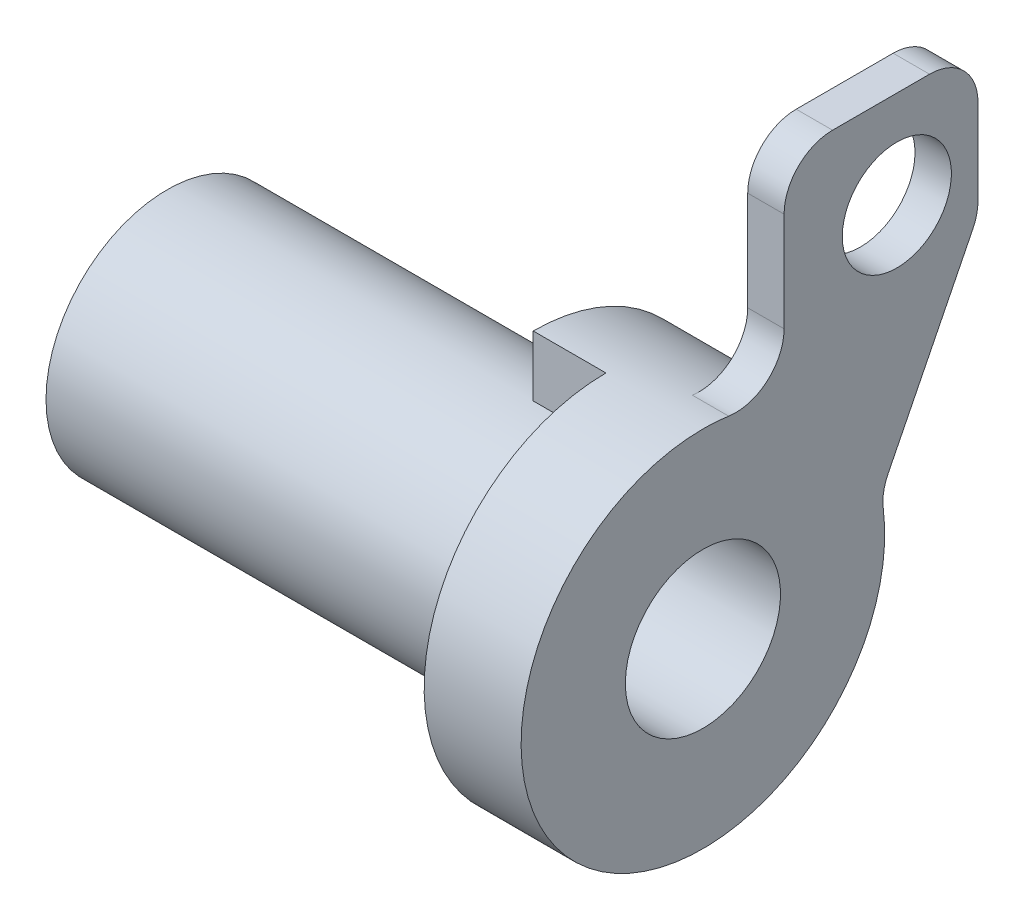
ISO-10303-21;
HEADER;
FILE_DESCRIPTION(('STEP AP214'),'2;1');
FILE_NAME('part.step','',(''),(''),'','','');
FILE_SCHEMA(('AUTOMOTIVE_DESIGN { 1 0 10303 214 1 1 1 1 }'));
ENDSEC;
DATA;
#1=APPLICATION_CONTEXT('core data for automotive mechanical design processes');
#2=APPLICATION_PROTOCOL_DEFINITION('international standard','automotive_design',2000,#1);
#3=PRODUCT_CONTEXT('',#1,'mechanical');
#4=PRODUCT('Part','Part','',(#3));
#5=PRODUCT_RELATED_PRODUCT_CATEGORY('part','',(#4));
#6=PRODUCT_DEFINITION_FORMATION('','',#4);
#7=PRODUCT_DEFINITION_CONTEXT('part definition',#1,'design');
#8=PRODUCT_DEFINITION('design','',#6,#7);
#9=PRODUCT_DEFINITION_SHAPE('','',#8);
#10=(LENGTH_UNIT() NAMED_UNIT(*) SI_UNIT(.MILLI.,.METRE.));
#11=(NAMED_UNIT(*) PLANE_ANGLE_UNIT() SI_UNIT($,.RADIAN.));
#12=(NAMED_UNIT(*) SI_UNIT($,.STERADIAN.) SOLID_ANGLE_UNIT());
#13=UNCERTAINTY_MEASURE_WITH_UNIT(LENGTH_MEASURE(1.E-05),#10,'distance_accuracy_value','');
#14=(GEOMETRIC_REPRESENTATION_CONTEXT(3) GLOBAL_UNCERTAINTY_ASSIGNED_CONTEXT((#13)) GLOBAL_UNIT_ASSIGNED_CONTEXT((#10,
#11,#12)) REPRESENTATION_CONTEXT('',''));
#15=CARTESIAN_POINT('',(0.,0.,0.));
#16=DIRECTION('',(0.,0.,1.));
#17=DIRECTION('',(1.,0.,0.));
#18=AXIS2_PLACEMENT_3D('',#15,#16,#17);
#19=CARTESIAN_POINT('',(0.,7.5,0.));
#20=DIRECTION('',(1.,0.,0.));
#21=DIRECTION('',(0.,0.,-1.));
#22=AXIS2_PLACEMENT_3D('',#19,#20,#21);
#23=PLANE('',#22);
#24=CARTESIAN_POINT('',(0.,0.,0.));
#25=DIRECTION('',(-1.,0.,0.));
#26=DIRECTION('',(0.,0.,1.));
#27=AXIS2_PLACEMENT_3D('',#24,#25,#26);
#28=CIRCLE('',#27,3.2);
#29=CARTESIAN_POINT('',(0.,0.,3.2));
#30=VERTEX_POINT('',#29);
#31=EDGE_CURVE('E222',#30,#30,#28,.T.);
#32=ORIENTED_EDGE('',*,*,#31,.F.);
#33=EDGE_LOOP('',(#32));
#34=FACE_BOUND('',#33,.T.);
#35=CARTESIAN_POINT('',(0.,0.,0.));
#36=DIRECTION('',(-1.,0.,0.));
#37=DIRECTION('',(0.,0.,1.));
#38=AXIS2_PLACEMENT_3D('',#35,#36,#37);
#39=CIRCLE('',#38,5.);
#40=CARTESIAN_POINT('',(0.,0.,5.));
#41=VERTEX_POINT('',#40);
#42=EDGE_CURVE('E199',#41,#41,#39,.T.);
#43=ORIENTED_EDGE('',*,*,#42,.T.);
#44=EDGE_LOOP('',(#43));
#45=FACE_BOUND('',#44,.T.);
#46=ADVANCED_FACE('F47',(#34,#45),#23,.F.);
#47=CARTESIAN_POINT('',(0.,0.,0.));
#48=DIRECTION('',(-1.,0.,0.));
#49=DIRECTION('',(0.,0.,1.));
#50=AXIS2_PLACEMENT_3D('',#47,#48,#49);
#51=CYLINDRICAL_SURFACE('',#50,7.5);
#52=CARTESIAN_POINT('',(20.6,0.,0.));
#53=DIRECTION('',(-1.,0.,0.));
#54=DIRECTION('',(0.,0.,-1.));
#55=AXIS2_PLACEMENT_3D('',#52,#53,#54);
#56=CIRCLE('',#55,7.5);
#57=CARTESIAN_POINT('',(20.6,7.42406003200721,-1.06458096974963));
#58=VERTEX_POINT('',#57);
#59=CARTESIAN_POINT('',(20.6,0.933969702377935,-7.4416194873858));
#60=VERTEX_POINT('',#59);
#61=EDGE_CURVE('E305',#58,#60,#56,.T.);
#62=ORIENTED_EDGE('',*,*,#61,.T.);
#63=DIRECTION('',(-1.,0.,0.));
#64=VECTOR('',#63,1.);
#65=CARTESIAN_POINT('',(0.,0.933969702377935,-7.4416194873858));
#66=LINE('',#65,#64);
#67=CARTESIAN_POINT('',(22.1,0.933969702377935,-7.4416194873858));
#68=VERTEX_POINT('',#67);
#69=EDGE_CURVE('E230',#60,#68,#66,.F.);
#70=ORIENTED_EDGE('',*,*,#69,.T.);
#71=CARTESIAN_POINT('',(22.1,0.,0.));
#72=DIRECTION('',(-1.,0.,0.));
#73=DIRECTION('',(0.,0.,1.));
#74=AXIS2_PLACEMENT_3D('',#71,#72,#73);
#75=CIRCLE('',#74,7.5);
#76=CARTESIAN_POINT('',(22.1,7.42406003200721,-1.06458096974963));
#77=VERTEX_POINT('',#76);
#78=EDGE_CURVE('E214',#68,#77,#75,.T.);
#79=ORIENTED_EDGE('',*,*,#78,.T.);
#80=DIRECTION('',(-1.,0.,0.));
#81=VECTOR('',#80,1.);
#82=CARTESIAN_POINT('',(0.,7.42406003200721,-1.06458096974963));
#83=LINE('',#82,#81);
#84=EDGE_CURVE('E226',#77,#58,#83,.T.);
#85=ORIENTED_EDGE('',*,*,#84,.T.);
#86=EDGE_LOOP('',(#62,#70,#79,#85));
#87=FACE_BOUND('',#86,.T.);
#88=CARTESIAN_POINT('',(15.1,0.,0.));
#89=DIRECTION('',(-1.,0.,0.));
#90=DIRECTION('',(0.,0.,1.));
#91=AXIS2_PLACEMENT_3D('',#88,#89,#90);
#92=CIRCLE('',#91,7.5);
#93=CARTESIAN_POINT('',(15.1,-7.30574766683525,-1.69589239886594));
#94=VERTEX_POINT('',#93);
#95=CARTESIAN_POINT('',(15.1,7.5,0.));
#96=VERTEX_POINT('',#95);
#97=EDGE_CURVE('E205',#94,#96,#92,.F.);
#98=ORIENTED_EDGE('',*,*,#97,.T.);
#99=DIRECTION('',(-1.,0.,0.));
#100=VECTOR('',#99,1.);
#101=CARTESIAN_POINT('',(18.1,7.5,0.));
#102=LINE('',#101,#100);
#103=CARTESIAN_POINT('',(18.1,7.5,0.));
#104=VERTEX_POINT('',#103);
#105=EDGE_CURVE('E200',#104,#96,#102,.T.);
#106=ORIENTED_EDGE('',*,*,#105,.F.);
#107=CARTESIAN_POINT('',(18.1,0.,0.));
#108=DIRECTION('',(-1.,0.,0.));
#109=DIRECTION('',(0.,0.,1.));
#110=AXIS2_PLACEMENT_3D('',#107,#108,#109);
#111=CIRCLE('',#110,7.5);
#112=CARTESIAN_POINT('',(18.1,-7.30574766683525,-1.69589239886594));
#113=VERTEX_POINT('',#112);
#114=EDGE_CURVE('E172',#113,#104,#111,.T.);
#115=ORIENTED_EDGE('',*,*,#114,.F.);
#116=DIRECTION('',(-1.,0.,0.));
#117=VECTOR('',#116,1.);
#118=CARTESIAN_POINT('',(18.1,-7.30574766683525,-1.69589239886594));
#119=LINE('',#118,#117);
#120=EDGE_CURVE('E162',#113,#94,#119,.T.);
#121=ORIENTED_EDGE('',*,*,#120,.T.);
#122=EDGE_LOOP('',(#98,#106,#115,#121));
#123=FACE_BOUND('',#122,.T.);
#124=ADVANCED_FACE('F298',(#87,#123),#51,.T.);
#125=CARTESIAN_POINT('',(0.,0.,0.));
#126=DIRECTION('',(-1.,0.,0.));
#127=DIRECTION('',(0.,0.,1.));
#128=AXIS2_PLACEMENT_3D('',#125,#126,#127);
#129=CYLINDRICAL_SURFACE('',#128,3.2);
#130=CARTESIAN_POINT('',(22.1,0.,0.));
#131=DIRECTION('',(-1.,0.,0.));
#132=DIRECTION('',(0.,0.,1.));
#133=AXIS2_PLACEMENT_3D('',#130,#131,#132);
#134=CIRCLE('',#133,3.2);
#135=CARTESIAN_POINT('',(22.1,0.,3.2));
#136=VERTEX_POINT('',#135);
#137=EDGE_CURVE('E218',#136,#136,#134,.T.);
#138=ORIENTED_EDGE('',*,*,#137,.F.);
#139=EDGE_LOOP('',(#138));
#140=FACE_BOUND('',#139,.T.);
#141=ORIENTED_EDGE('',*,*,#31,.T.);
#142=EDGE_LOOP('',(#141));
#143=FACE_BOUND('',#142,.T.);
#144=ADVANCED_FACE('F374',(#140,#143),#129,.F.);
#145=CARTESIAN_POINT('',(22.1,7.5,0.));
#146=DIRECTION('',(-1.,0.,0.));
#147=DIRECTION('',(0.,0.,1.));
#148=AXIS2_PLACEMENT_3D('',#145,#146,#147);
#149=PLANE('',#148);
#150=CARTESIAN_POINT('',(22.1,11.5,-8.));
#151=DIRECTION('',(-1.,0.,0.));
#152=DIRECTION('',(0.,0.,1.));
#153=AXIS2_PLACEMENT_3D('',#150,#151,#152);
#154=CIRCLE('',#153,2.25);
#155=CARTESIAN_POINT('',(22.1,11.5,-5.75));
#156=VERTEX_POINT('',#155);
#157=EDGE_CURVE('E429',#156,#156,#154,.T.);
#158=ORIENTED_EDGE('',*,*,#157,.T.);
#159=EDGE_LOOP('',(#158));
#160=FACE_BOUND('',#159,.T.);
#161=DIRECTION('',(0.,0.894427190999916,-0.447213595499958));
#162=VECTOR('',#161,1.);
#163=CARTESIAN_POINT('',(22.1,1.5,-7.34846922834953));
#164=LINE('',#163,#162);
#165=CARTESIAN_POINT('',(22.1,2.07745548067863,-7.63719696868885));
#166=VERTEX_POINT('',#165);
#167=CARTESIAN_POINT('',(22.1,9.07770876399967,-11.1373236103494));
#168=VERTEX_POINT('',#167);
#169=EDGE_CURVE('E319',#166,#168,#164,.T.);
#170=ORIENTED_EDGE('',*,*,#169,.T.);
#171=CARTESIAN_POINT('',(22.1,9.97213595499958,-9.34846922834953));
#172=DIRECTION('',(-1.,0.,0.));
#173=DIRECTION('',(0.,0.,1.));
#174=AXIS2_PLACEMENT_3D('',#171,#172,#173);
#175=CIRCLE('',#174,2.);
#176=CARTESIAN_POINT('',(22.1,9.97213595499958,-11.3484692283495));
#177=VERTEX_POINT('',#176);
#178=EDGE_CURVE('E247',#168,#177,#175,.F.);
#179=ORIENTED_EDGE('',*,*,#178,.T.);
#180=DIRECTION('',(0.,1.,0.));
#181=VECTOR('',#180,1.);
#182=CARTESIAN_POINT('',(22.1,9.5,-11.3484692283495));
#183=LINE('',#182,#181);
#184=CARTESIAN_POINT('',(22.1,13.5,-11.3484692283495));
#185=VERTEX_POINT('',#184);
#186=EDGE_CURVE('E322',#177,#185,#183,.T.);
#187=ORIENTED_EDGE('',*,*,#186,.T.);
#188=CARTESIAN_POINT('',(22.1,13.5,-9.34846922834953));
#189=DIRECTION('',(-1.,0.,0.));
#190=DIRECTION('',(0.,0.,1.));
#191=AXIS2_PLACEMENT_3D('',#188,#189,#190);
#192=CIRCLE('',#191,2.);
#193=CARTESIAN_POINT('',(22.1,15.5,-9.34846922834953));
#194=VERTEX_POINT('',#193);
#195=EDGE_CURVE('E244',#185,#194,#192,.F.);
#196=ORIENTED_EDGE('',*,*,#195,.T.);
#197=DIRECTION('',(0.,0.,1.));
#198=VECTOR('',#197,1.);
#199=CARTESIAN_POINT('',(22.1,15.5,-11.3484692283495));
#200=LINE('',#199,#198);
#201=CARTESIAN_POINT('',(22.1,15.5,-5.34846922834953));
#202=VERTEX_POINT('',#201);
#203=EDGE_CURVE('E326',#194,#202,#200,.T.);
#204=ORIENTED_EDGE('',*,*,#203,.T.);
#205=CARTESIAN_POINT('',(22.1,13.5,-5.34846922834953));
#206=DIRECTION('',(-1.,0.,0.));
#207=DIRECTION('',(0.,0.,1.));
#208=AXIS2_PLACEMENT_3D('',#205,#206,#207);
#209=CIRCLE('',#208,2.);
#210=CARTESIAN_POINT('',(22.1,13.5,-3.34846922834953));
#211=VERTEX_POINT('',#210);
#212=EDGE_CURVE('E241',#202,#211,#209,.F.);
#213=ORIENTED_EDGE('',*,*,#212,.T.);
#214=DIRECTION('',(0.,-1.,0.));
#215=VECTOR('',#214,1.);
#216=CARTESIAN_POINT('',(22.1,6.71101734663205,-3.34846922834953));
#217=LINE('',#216,#215);
#218=CARTESIAN_POINT('',(22.1,9.4038093738758,-3.34846922834953));
#219=VERTEX_POINT('',#218);
#220=EDGE_CURVE('E186',#211,#219,#217,.T.);
#221=ORIENTED_EDGE('',*,*,#220,.T.);
#222=CARTESIAN_POINT('',(22.1,9.4038093738758,-1.34846922834953));
#223=DIRECTION('',(-1.,0.,0.));
#224=DIRECTION('',(0.,0.,1.));
#225=AXIS2_PLACEMENT_3D('',#222,#223,#224);
#226=CIRCLE('',#225,2.);
#227=EDGE_CURVE('E56',#219,#77,#226,.T.);
#228=ORIENTED_EDGE('',*,*,#227,.T.);
#229=ORIENTED_EDGE('',*,*,#78,.F.);
#230=CARTESIAN_POINT('',(22.1,1.18302828967872,-9.42605135068868));
#231=DIRECTION('',(-1.,0.,0.));
#232=DIRECTION('',(0.,0.,1.));
#233=AXIS2_PLACEMENT_3D('',#230,#231,#232);
#234=CIRCLE('',#233,2.);
#235=EDGE_CURVE('E278',#68,#166,#234,.T.);
#236=ORIENTED_EDGE('',*,*,#235,.T.);
#237=EDGE_LOOP('',(#170,#179,#187,#196,#204,#213,#221,#228,#229,#236));
#238=FACE_BOUND('',#237,.T.);
#239=ORIENTED_EDGE('',*,*,#137,.T.);
#240=EDGE_LOOP('',(#239));
#241=FACE_BOUND('',#240,.T.);
#242=ADVANCED_FACE('F291',(#160,#238,#241),#149,.F.);
#243=CARTESIAN_POINT('',(43.3132034355964,0.,0.));
#244=DIRECTION('',(-1.,0.,0.));
#245=DIRECTION('',(0.,0.,1.));
#246=AXIS2_PLACEMENT_3D('',#243,#244,#245);
#247=CYLINDRICAL_SURFACE('',#246,5.);
#248=CARTESIAN_POINT('',(15.1,0.,0.));
#249=DIRECTION('',(-1.,0.,0.));
#250=DIRECTION('',(0.,0.,1.));
#251=AXIS2_PLACEMENT_3D('',#248,#249,#250);
#252=CIRCLE('',#251,5.);
#253=CARTESIAN_POINT('',(15.1,-4.95722430686906,0.652630961100226));
#254=VERTEX_POINT('',#253);
#255=CARTESIAN_POINT('',(15.1,5.,0.));
#256=VERTEX_POINT('',#255);
#257=EDGE_CURVE('E158',#254,#256,#252,.F.);
#258=ORIENTED_EDGE('',*,*,#257,.F.);
#259=DIRECTION('',(-1.,0.,0.));
#260=VECTOR('',#259,1.);
#261=CARTESIAN_POINT('',(18.1,-4.95722430686906,0.652630961100225));
#262=LINE('',#261,#260);
#263=CARTESIAN_POINT('',(18.1,-4.95722430686906,0.652630961100225));
#264=VERTEX_POINT('',#263);
#265=EDGE_CURVE('E150',#264,#254,#262,.T.);
#266=ORIENTED_EDGE('',*,*,#265,.F.);
#267=CARTESIAN_POINT('',(18.1,0.,0.));
#268=DIRECTION('',(1.,0.,0.));
#269=DIRECTION('',(0.,0.,1.));
#270=AXIS2_PLACEMENT_3D('',#267,#268,#269);
#271=CIRCLE('',#270,5.);
#272=CARTESIAN_POINT('',(18.1,5.,0.));
#273=VERTEX_POINT('',#272);
#274=EDGE_CURVE('E155',#273,#264,#271,.T.);
#275=ORIENTED_EDGE('',*,*,#274,.F.);
#276=DIRECTION('',(-1.,0.,0.));
#277=VECTOR('',#276,1.);
#278=CARTESIAN_POINT('',(18.1,5.,0.));
#279=LINE('',#278,#277);
#280=EDGE_CURVE('E196',#273,#256,#279,.T.);
#281=ORIENTED_EDGE('',*,*,#280,.T.);
#282=EDGE_LOOP('',(#258,#266,#275,#281));
#283=FACE_BOUND('',#282,.T.);
#284=ORIENTED_EDGE('',*,*,#42,.F.);
#285=EDGE_LOOP('',(#284));
#286=FACE_BOUND('',#285,.T.);
#287=ADVANCED_FACE('F152',(#283,#286),#247,.T.);
#288=CARTESIAN_POINT('',(15.1,7.5,0.));
#289=DIRECTION('',(-1.,0.,0.));
#290=DIRECTION('',(0.,0.,1.));
#291=AXIS2_PLACEMENT_3D('',#288,#289,#290);
#292=PLANE('',#291);
#293=DIRECTION('',(0.,-1.,0.));
#294=VECTOR('',#293,1.);
#295=CARTESIAN_POINT('',(15.1,5.,0.));
#296=LINE('',#295,#294);
#297=EDGE_CURVE('E177',#96,#256,#296,.T.);
#298=ORIENTED_EDGE('',*,*,#297,.F.);
#299=ORIENTED_EDGE('',*,*,#97,.F.);
#300=DIRECTION('',(0.,-0.707106781186551,-0.707106781186544));
#301=VECTOR('',#300,1.);
#302=CARTESIAN_POINT('',(15.1,-4.95722430686906,0.652630961100225));
#303=LINE('',#302,#301);
#304=EDGE_CURVE('E183',#254,#94,#303,.T.);
#305=ORIENTED_EDGE('',*,*,#304,.F.);
#306=ORIENTED_EDGE('',*,*,#257,.T.);
#307=EDGE_LOOP('',(#298,#299,#305,#306));
#308=FACE_BOUND('',#307,.T.);
#309=ADVANCED_FACE('F413',(#308),#292,.T.);
#310=CARTESIAN_POINT('',(18.1,5.,0.));
#311=DIRECTION('',(0.,0.,-1.));
#312=DIRECTION('',(-1.,0.,0.));
#313=AXIS2_PLACEMENT_3D('',#310,#311,#312);
#314=PLANE('',#313);
#315=ORIENTED_EDGE('',*,*,#297,.T.);
#316=ORIENTED_EDGE('',*,*,#280,.F.);
#317=DIRECTION('',(0.,-1.,0.));
#318=VECTOR('',#317,1.);
#319=CARTESIAN_POINT('',(18.1,5.,0.));
#320=LINE('',#319,#318);
#321=EDGE_CURVE('E163',#104,#273,#320,.T.);
#322=ORIENTED_EDGE('',*,*,#321,.F.);
#323=ORIENTED_EDGE('',*,*,#105,.T.);
#324=EDGE_LOOP('',(#315,#316,#322,#323));
#325=FACE_BOUND('',#324,.T.);
#326=ADVANCED_FACE('F410',(#325),#314,.F.);
#327=CARTESIAN_POINT('',(18.1,-4.95722430686906,0.652630961100225));
#328=DIRECTION('',(0.,0.707106781186544,-0.707106781186551));
#329=DIRECTION('',(0.,0.707106781186551,0.707106781186544));
#330=AXIS2_PLACEMENT_3D('',#327,#328,#329);
#331=PLANE('',#330);
#332=ORIENTED_EDGE('',*,*,#304,.T.);
#333=ORIENTED_EDGE('',*,*,#120,.F.);
#334=DIRECTION('',(0.,-0.707106781186551,-0.707106781186544));
#335=VECTOR('',#334,1.);
#336=CARTESIAN_POINT('',(18.1,-4.95722430686906,0.652630961100225));
#337=LINE('',#336,#335);
#338=EDGE_CURVE('E166',#264,#113,#337,.T.);
#339=ORIENTED_EDGE('',*,*,#338,.F.);
#340=ORIENTED_EDGE('',*,*,#265,.T.);
#341=EDGE_LOOP('',(#332,#333,#339,#340));
#342=FACE_BOUND('',#341,.T.);
#343=ADVANCED_FACE('F167',(#342),#331,.F.);
#344=CARTESIAN_POINT('',(18.1,0.,0.));
#345=DIRECTION('',(-1.,0.,0.));
#346=DIRECTION('',(0.,0.,1.));
#347=AXIS2_PLACEMENT_3D('',#344,#345,#346);
#348=PLANE('',#347);
#349=ORIENTED_EDGE('',*,*,#274,.T.);
#350=ORIENTED_EDGE('',*,*,#338,.T.);
#351=ORIENTED_EDGE('',*,*,#114,.T.);
#352=ORIENTED_EDGE('',*,*,#321,.T.);
#353=EDGE_LOOP('',(#349,#350,#351,#352));
#354=FACE_BOUND('',#353,.T.);
#355=ADVANCED_FACE('F174',(#354),#348,.T.);
#356=CARTESIAN_POINT('',(20.6,6.71101734663205,-3.34846922834953));
#357=DIRECTION('',(0.,0.,1.));
#358=DIRECTION('',(1.,0.,0.));
#359=AXIS2_PLACEMENT_3D('',#356,#357,#358);
#360=PLANE('',#359);
#361=ORIENTED_EDGE('',*,*,#220,.F.);
#362=DIRECTION('',(1.,0.,0.));
#363=VECTOR('',#362,1.);
#364=CARTESIAN_POINT('',(20.6,13.5,-3.34846922834953));
#365=LINE('',#364,#363);
#366=CARTESIAN_POINT('',(20.6,13.5,-3.34846922834953));
#367=VERTEX_POINT('',#366);
#368=EDGE_CURVE('E275',#211,#367,#365,.F.);
#369=ORIENTED_EDGE('',*,*,#368,.T.);
#370=DIRECTION('',(0.,-1.,0.));
#371=VECTOR('',#370,1.);
#372=CARTESIAN_POINT('',(20.6,6.71101734663205,-3.34846922834953));
#373=LINE('',#372,#371);
#374=CARTESIAN_POINT('',(20.6,9.4038093738758,-3.34846922834953));
#375=VERTEX_POINT('',#374);
#376=EDGE_CURVE('E194',#367,#375,#373,.T.);
#377=ORIENTED_EDGE('',*,*,#376,.T.);
#378=DIRECTION('',(-1.,0.,0.));
#379=VECTOR('',#378,1.);
#380=CARTESIAN_POINT('',(20.6,9.4038093738758,-3.34846922834953));
#381=LINE('',#380,#379);
#382=EDGE_CURVE('E271',#375,#219,#381,.F.);
#383=ORIENTED_EDGE('',*,*,#382,.T.);
#384=EDGE_LOOP('',(#361,#369,#377,#383));
#385=FACE_BOUND('',#384,.T.);
#386=ADVANCED_FACE('F307',(#385),#360,.T.);
#387=CARTESIAN_POINT('',(20.6,15.5,-11.3484692283495));
#388=DIRECTION('',(0.,1.,0.));
#389=DIRECTION('',(0.,0.,1.));
#390=AXIS2_PLACEMENT_3D('',#387,#388,#389);
#391=PLANE('',#390);
#392=ORIENTED_EDGE('',*,*,#203,.F.);
#393=DIRECTION('',(1.,0.,0.));
#394=VECTOR('',#393,1.);
#395=CARTESIAN_POINT('',(20.6,15.5,-9.34846922834953));
#396=LINE('',#395,#394);
#397=CARTESIAN_POINT('',(20.6,15.5,-9.34846922834953));
#398=VERTEX_POINT('',#397);
#399=EDGE_CURVE('E70',#194,#398,#396,.F.);
#400=ORIENTED_EDGE('',*,*,#399,.T.);
#401=DIRECTION('',(0.,0.,1.));
#402=VECTOR('',#401,1.);
#403=CARTESIAN_POINT('',(20.6,15.5,-11.3484692283495));
#404=LINE('',#403,#402);
#405=CARTESIAN_POINT('',(20.6,15.5,-5.34846922834953));
#406=VERTEX_POINT('',#405);
#407=EDGE_CURVE('E310',#398,#406,#404,.T.);
#408=ORIENTED_EDGE('',*,*,#407,.T.);
#409=DIRECTION('',(1.,0.,0.));
#410=VECTOR('',#409,1.);
#411=CARTESIAN_POINT('',(20.6,15.5,-5.34846922834953));
#412=LINE('',#411,#410);
#413=EDGE_CURVE('E265',#406,#202,#412,.T.);
#414=ORIENTED_EDGE('',*,*,#413,.T.);
#415=EDGE_LOOP('',(#392,#400,#408,#414));
#416=FACE_BOUND('',#415,.T.);
#417=ADVANCED_FACE('F357',(#416),#391,.T.);
#418=CARTESIAN_POINT('',(20.6,9.5,-11.3484692283495));
#419=DIRECTION('',(0.,0.,-1.));
#420=DIRECTION('',(-1.,0.,0.));
#421=AXIS2_PLACEMENT_3D('',#418,#419,#420);
#422=PLANE('',#421);
#423=ORIENTED_EDGE('',*,*,#186,.F.);
#424=DIRECTION('',(1.,0.,0.));
#425=VECTOR('',#424,1.);
#426=CARTESIAN_POINT('',(20.6,9.97213595499958,-11.3484692283495));
#427=LINE('',#426,#425);
#428=CARTESIAN_POINT('',(20.6,9.97213595499958,-11.3484692283495));
#429=VERTEX_POINT('',#428);
#430=EDGE_CURVE('E254',#177,#429,#427,.F.);
#431=ORIENTED_EDGE('',*,*,#430,.T.);
#432=DIRECTION('',(0.,1.,0.));
#433=VECTOR('',#432,1.);
#434=CARTESIAN_POINT('',(20.6,9.5,-11.3484692283495));
#435=LINE('',#434,#433);
#436=CARTESIAN_POINT('',(20.6,13.5,-11.3484692283495));
#437=VERTEX_POINT('',#436);
#438=EDGE_CURVE('E315',#429,#437,#435,.T.);
#439=ORIENTED_EDGE('',*,*,#438,.T.);
#440=DIRECTION('',(1.,0.,0.));
#441=VECTOR('',#440,1.);
#442=CARTESIAN_POINT('',(20.6,13.5,-11.3484692283495));
#443=LINE('',#442,#441);
#444=EDGE_CURVE('E250',#437,#185,#443,.T.);
#445=ORIENTED_EDGE('',*,*,#444,.T.);
#446=EDGE_LOOP('',(#423,#431,#439,#445));
#447=FACE_BOUND('',#446,.T.);
#448=ADVANCED_FACE('F351',(#447),#422,.T.);
#449=CARTESIAN_POINT('',(20.6,1.5,-7.34846922834953));
#450=DIRECTION('',(0.,-0.447213595499958,-0.894427190999916));
#451=DIRECTION('',(0.,0.894427190999916,-0.447213595499958));
#452=AXIS2_PLACEMENT_3D('',#449,#450,#451);
#453=PLANE('',#452);
#454=ORIENTED_EDGE('',*,*,#169,.F.);
#455=DIRECTION('',(-1.,0.,0.));
#456=VECTOR('',#455,1.);
#457=CARTESIAN_POINT('',(20.6,2.07745548067863,-7.63719696868885));
#458=LINE('',#457,#456);
#459=CARTESIAN_POINT('',(20.6,2.07745548067863,-7.63719696868885));
#460=VERTEX_POINT('',#459);
#461=EDGE_CURVE('E238',#166,#460,#458,.T.);
#462=ORIENTED_EDGE('',*,*,#461,.T.);
#463=DIRECTION('',(0.,0.894427190999916,-0.447213595499958));
#464=VECTOR('',#463,1.);
#465=CARTESIAN_POINT('',(20.6,1.5,-7.34846922834953));
#466=LINE('',#465,#464);
#467=CARTESIAN_POINT('',(20.6,9.07770876399967,-11.1373236103494));
#468=VERTEX_POINT('',#467);
#469=EDGE_CURVE('E335',#460,#468,#466,.T.);
#470=ORIENTED_EDGE('',*,*,#469,.T.);
#471=DIRECTION('',(1.,0.,0.));
#472=VECTOR('',#471,1.);
#473=CARTESIAN_POINT('',(20.6,9.07770876399967,-11.1373236103494));
#474=LINE('',#473,#472);
#475=EDGE_CURVE('E234',#468,#168,#474,.T.);
#476=ORIENTED_EDGE('',*,*,#475,.T.);
#477=EDGE_LOOP('',(#454,#462,#470,#476));
#478=FACE_BOUND('',#477,.T.);
#479=ADVANCED_FACE('F395',(#478),#453,.T.);
#480=CARTESIAN_POINT('',(20.6,0.,0.));
#481=DIRECTION('',(1.,0.,0.));
#482=DIRECTION('',(0.,0.,-1.));
#483=AXIS2_PLACEMENT_3D('',#480,#481,#482);
#484=PLANE('',#483);
#485=CARTESIAN_POINT('',(20.6,11.5,-8.));
#486=DIRECTION('',(1.,0.,0.));
#487=DIRECTION('',(0.,0.,-1.));
#488=AXIS2_PLACEMENT_3D('',#485,#486,#487);
#489=CIRCLE('',#488,2.25);
#490=CARTESIAN_POINT('',(20.6,11.5,-10.25));
#491=VERTEX_POINT('',#490);
#492=EDGE_CURVE('E323',#491,#491,#489,.T.);
#493=ORIENTED_EDGE('',*,*,#492,.T.);
#494=EDGE_LOOP('',(#493));
#495=FACE_BOUND('',#494,.T.);
#496=ORIENTED_EDGE('',*,*,#438,.F.);
#497=CARTESIAN_POINT('',(20.6,9.97213595499958,-9.34846922834953));
#498=DIRECTION('',(1.,0.,0.));
#499=DIRECTION('',(0.,0.,-1.));
#500=AXIS2_PLACEMENT_3D('',#497,#498,#499);
#501=CIRCLE('',#500,2.);
#502=EDGE_CURVE('E262',#429,#468,#501,.F.);
#503=ORIENTED_EDGE('',*,*,#502,.T.);
#504=ORIENTED_EDGE('',*,*,#469,.F.);
#505=CARTESIAN_POINT('',(20.6,1.18302828967872,-9.42605135068868));
#506=DIRECTION('',(1.,0.,0.));
#507=DIRECTION('',(0.,0.,-1.));
#508=AXIS2_PLACEMENT_3D('',#505,#506,#507);
#509=CIRCLE('',#508,2.);
#510=EDGE_CURVE('E281',#460,#60,#509,.T.);
#511=ORIENTED_EDGE('',*,*,#510,.T.);
#512=ORIENTED_EDGE('',*,*,#61,.F.);
#513=CARTESIAN_POINT('',(20.6,9.4038093738758,-1.34846922834953));
#514=DIRECTION('',(1.,0.,0.));
#515=DIRECTION('',(0.,0.,-1.));
#516=AXIS2_PLACEMENT_3D('',#513,#514,#515);
#517=CIRCLE('',#516,2.);
#518=EDGE_CURVE('E12',#58,#375,#517,.T.);
#519=ORIENTED_EDGE('',*,*,#518,.T.);
#520=ORIENTED_EDGE('',*,*,#376,.F.);
#521=CARTESIAN_POINT('',(20.6,13.5,-5.34846922834953));
#522=DIRECTION('',(1.,0.,0.));
#523=DIRECTION('',(0.,0.,-1.));
#524=AXIS2_PLACEMENT_3D('',#521,#522,#523);
#525=CIRCLE('',#524,2.);
#526=EDGE_CURVE('E63',#367,#406,#525,.F.);
#527=ORIENTED_EDGE('',*,*,#526,.T.);
#528=ORIENTED_EDGE('',*,*,#407,.F.);
#529=CARTESIAN_POINT('',(20.6,13.5,-9.34846922834953));
#530=DIRECTION('',(1.,0.,0.));
#531=DIRECTION('',(0.,0.,-1.));
#532=AXIS2_PLACEMENT_3D('',#529,#530,#531);
#533=CIRCLE('',#532,2.);
#534=EDGE_CURVE('E259',#398,#437,#533,.F.);
#535=ORIENTED_EDGE('',*,*,#534,.T.);
#536=EDGE_LOOP('',(#496,#503,#504,#511,#512,#519,#520,#527,#528,#535));
#537=FACE_BOUND('',#536,.T.);
#538=ADVANCED_FACE('F304',(#495,#537),#484,.F.);
#539=CARTESIAN_POINT('',(18.1,11.5,-8.));
#540=DIRECTION('',(-1.,0.,0.));
#541=DIRECTION('',(0.,0.,1.));
#542=AXIS2_PLACEMENT_3D('',#539,#540,#541);
#543=CYLINDRICAL_SURFACE('',#542,2.25);
#544=ORIENTED_EDGE('',*,*,#157,.F.);
#545=EDGE_LOOP('',(#544));
#546=FACE_BOUND('',#545,.T.);
#547=ORIENTED_EDGE('',*,*,#492,.F.);
#548=EDGE_LOOP('',(#547));
#549=FACE_BOUND('',#548,.T.);
#550=ADVANCED_FACE('F384',(#546,#549),#543,.F.);
#551=CARTESIAN_POINT('',(0.,1.18302828967872,-9.42605135068868));
#552=DIRECTION('',(-1.,0.,0.));
#553=DIRECTION('',(0.,0.,1.));
#554=AXIS2_PLACEMENT_3D('',#551,#552,#553);
#555=CYLINDRICAL_SURFACE('',#554,2.);
#556=ORIENTED_EDGE('',*,*,#510,.F.);
#557=ORIENTED_EDGE('',*,*,#461,.F.);
#558=ORIENTED_EDGE('',*,*,#235,.F.);
#559=ORIENTED_EDGE('',*,*,#69,.F.);
#560=EDGE_LOOP('',(#556,#557,#558,#559));
#561=FACE_BOUND('',#560,.T.);
#562=ADVANCED_FACE('F381',(#561),#555,.F.);
#563=CARTESIAN_POINT('',(20.6,9.97213595499958,-9.34846922834953));
#564=DIRECTION('',(1.,0.,0.));
#565=DIRECTION('',(0.,0.,-1.));
#566=AXIS2_PLACEMENT_3D('',#563,#564,#565);
#567=CYLINDRICAL_SURFACE('',#566,2.);
#568=ORIENTED_EDGE('',*,*,#502,.F.);
#569=ORIENTED_EDGE('',*,*,#430,.F.);
#570=ORIENTED_EDGE('',*,*,#178,.F.);
#571=ORIENTED_EDGE('',*,*,#475,.F.);
#572=EDGE_LOOP('',(#568,#569,#570,#571));
#573=FACE_BOUND('',#572,.T.);
#574=ADVANCED_FACE('F366',(#573),#567,.T.);
#575=CARTESIAN_POINT('',(20.6,13.5,-9.34846922834953));
#576=DIRECTION('',(1.,0.,0.));
#577=DIRECTION('',(0.,0.,-1.));
#578=AXIS2_PLACEMENT_3D('',#575,#576,#577);
#579=CYLINDRICAL_SURFACE('',#578,2.);
#580=ORIENTED_EDGE('',*,*,#534,.F.);
#581=ORIENTED_EDGE('',*,*,#399,.F.);
#582=ORIENTED_EDGE('',*,*,#195,.F.);
#583=ORIENTED_EDGE('',*,*,#444,.F.);
#584=EDGE_LOOP('',(#580,#581,#582,#583));
#585=FACE_BOUND('',#584,.T.);
#586=ADVANCED_FACE('F356',(#585),#579,.T.);
#587=CARTESIAN_POINT('',(20.6,13.5,-5.34846922834953));
#588=DIRECTION('',(1.,0.,0.));
#589=DIRECTION('',(0.,0.,-1.));
#590=AXIS2_PLACEMENT_3D('',#587,#588,#589);
#591=CYLINDRICAL_SURFACE('',#590,2.);
#592=ORIENTED_EDGE('',*,*,#526,.F.);
#593=ORIENTED_EDGE('',*,*,#368,.F.);
#594=ORIENTED_EDGE('',*,*,#212,.F.);
#595=ORIENTED_EDGE('',*,*,#413,.F.);
#596=EDGE_LOOP('',(#592,#593,#594,#595));
#597=FACE_BOUND('',#596,.T.);
#598=ADVANCED_FACE('F360',(#597),#591,.T.);
#599=CARTESIAN_POINT('',(0.,9.4038093738758,-1.34846922834953));
#600=DIRECTION('',(-1.,0.,0.));
#601=DIRECTION('',(0.,0.,1.));
#602=AXIS2_PLACEMENT_3D('',#599,#600,#601);
#603=CYLINDRICAL_SURFACE('',#602,2.);
#604=ORIENTED_EDGE('',*,*,#518,.F.);
#605=ORIENTED_EDGE('',*,*,#84,.F.);
#606=ORIENTED_EDGE('',*,*,#227,.F.);
#607=ORIENTED_EDGE('',*,*,#382,.F.);
#608=EDGE_LOOP('',(#604,#605,#606,#607));
#609=FACE_BOUND('',#608,.T.);
#610=ADVANCED_FACE('F49',(#609),#603,.F.);
#611=CLOSED_SHELL('',(#46,#124,#144,#242,#287,#309,#326,#343,#355,#386,#417,#448,#479,#538,#550,
#562,#574,#586,#598,#610));
#612=MANIFOLD_SOLID_BREP('B2',#611);
#613=ADVANCED_BREP_SHAPE_REPRESENTATION('',(#18,#612),#14);
#614=SHAPE_DEFINITION_REPRESENTATION(#9,#613);
ENDSEC;
END-ISO-10303-21;
